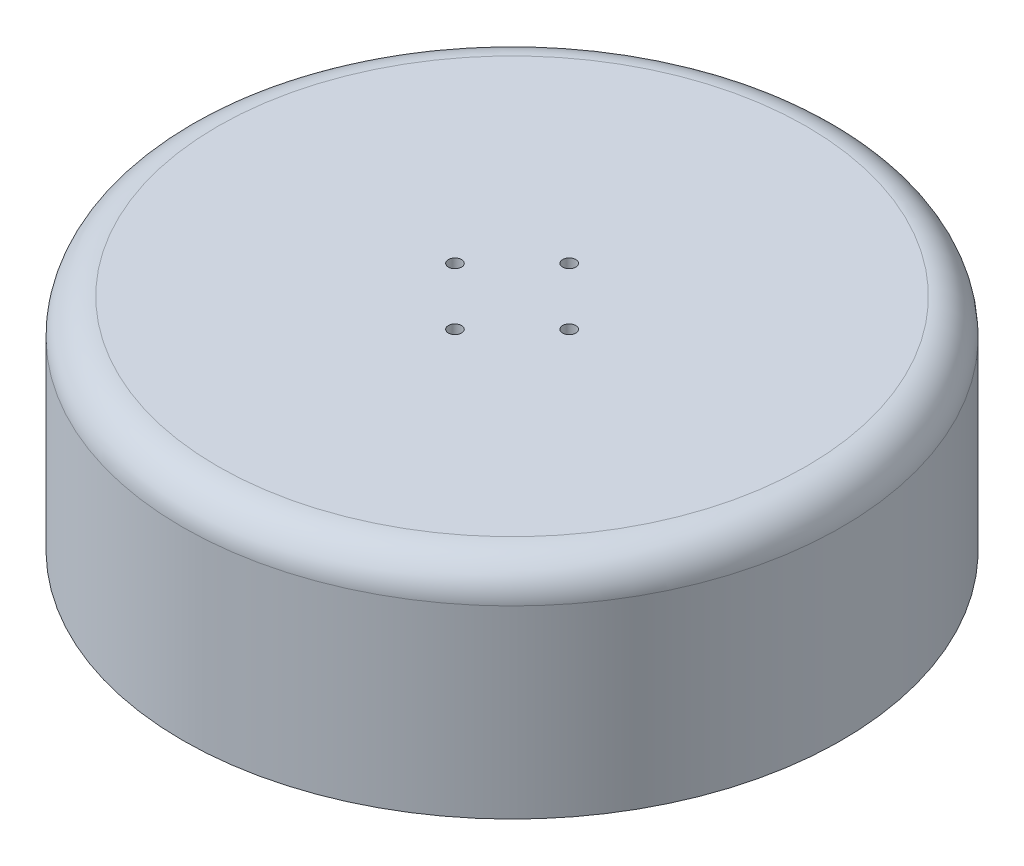
ISO-10303-21;
HEADER;
FILE_DESCRIPTION(('STEP AP214'),'2;1');
FILE_NAME('part.step','',(''),(''),'','','');
FILE_SCHEMA(('AUTOMOTIVE_DESIGN { 1 0 10303 214 1 1 1 1 }'));
ENDSEC;
DATA;
#1=APPLICATION_CONTEXT('core data for automotive mechanical design processes');
#2=APPLICATION_PROTOCOL_DEFINITION('international standard','automotive_design',2000,#1);
#3=PRODUCT_CONTEXT('',#1,'mechanical');
#4=PRODUCT('Part','Part','',(#3));
#5=PRODUCT_RELATED_PRODUCT_CATEGORY('part','',(#4));
#6=PRODUCT_DEFINITION_FORMATION('','',#4);
#7=PRODUCT_DEFINITION_CONTEXT('part definition',#1,'design');
#8=PRODUCT_DEFINITION('design','',#6,#7);
#9=PRODUCT_DEFINITION_SHAPE('','',#8);
#10=(LENGTH_UNIT() NAMED_UNIT(*) SI_UNIT(.MILLI.,.METRE.));
#11=(NAMED_UNIT(*) PLANE_ANGLE_UNIT() SI_UNIT($,.RADIAN.));
#12=(NAMED_UNIT(*) SI_UNIT($,.STERADIAN.) SOLID_ANGLE_UNIT());
#13=UNCERTAINTY_MEASURE_WITH_UNIT(LENGTH_MEASURE(1.E-05),#10,'distance_accuracy_value','');
#14=(GEOMETRIC_REPRESENTATION_CONTEXT(3) GLOBAL_UNCERTAINTY_ASSIGNED_CONTEXT((#13)) GLOBAL_UNIT_ASSIGNED_CONTEXT((#10,
#11,#12)) REPRESENTATION_CONTEXT('',''));
#15=CARTESIAN_POINT('',(0.,0.,0.));
#16=DIRECTION('',(0.,0.,1.));
#17=DIRECTION('',(1.,0.,0.));
#18=AXIS2_PLACEMENT_3D('',#15,#16,#17);
#19=CARTESIAN_POINT('',(0.,50.,0.));
#20=DIRECTION('',(0.,-1.,0.));
#21=DIRECTION('',(0.,0.,-1.));
#22=AXIS2_PLACEMENT_3D('',#19,#20,#21);
#23=CYLINDRICAL_SURFACE('',#22,75.);
#24=CARTESIAN_POINT('',(0.,42.,0.));
#25=DIRECTION('',(0.,1.,0.));
#26=DIRECTION('',(0.,0.,1.));
#27=AXIS2_PLACEMENT_3D('',#24,#25,#26);
#28=CIRCLE('',#27,75.);
#29=CARTESIAN_POINT('',(0.,42.,75.));
#30=VERTEX_POINT('',#29);
#31=EDGE_CURVE('E10',#30,#30,#28,.F.);
#32=ORIENTED_EDGE('',*,*,#31,.T.);
#33=EDGE_LOOP('',(#32));
#34=FACE_BOUND('',#33,.T.);
#35=CARTESIAN_POINT('',(0.,0.,0.));
#36=DIRECTION('',(0.,1.,0.));
#37=DIRECTION('',(0.,0.,1.));
#38=AXIS2_PLACEMENT_3D('',#35,#36,#37);
#39=CIRCLE('',#38,75.);
#40=CARTESIAN_POINT('',(0.,0.,75.));
#41=VERTEX_POINT('',#40);
#42=EDGE_CURVE('E42',#41,#41,#39,.T.);
#43=ORIENTED_EDGE('',*,*,#42,.T.);
#44=EDGE_LOOP('',(#43));
#45=FACE_BOUND('',#44,.T.);
#46=ADVANCED_FACE('F31',(#34,#45),#23,.T.);
#47=CARTESIAN_POINT('',(0.,50.,0.));
#48=DIRECTION('',(0.,1.,0.));
#49=DIRECTION('',(0.,0.,1.));
#50=AXIS2_PLACEMENT_3D('',#47,#48,#49);
#51=PLANE('',#50);
#52=CARTESIAN_POINT('',(0.,50.,-13.));
#53=DIRECTION('',(0.,1.,0.));
#54=DIRECTION('',(0.,0.,1.));
#55=AXIS2_PLACEMENT_3D('',#52,#53,#54);
#56=CIRCLE('',#55,1.5);
#57=CARTESIAN_POINT('',(0.,50.,-11.5));
#58=VERTEX_POINT('',#57);
#59=EDGE_CURVE('E67',#58,#58,#56,.T.);
#60=ORIENTED_EDGE('',*,*,#59,.F.);
#61=EDGE_LOOP('',(#60));
#62=FACE_BOUND('',#61,.T.);
#63=CARTESIAN_POINT('',(13.0000000000004,50.,-3.6789018175636E-13));
#64=DIRECTION('',(0.,1.,0.));
#65=DIRECTION('',(0.,0.,1.));
#66=AXIS2_PLACEMENT_3D('',#63,#64,#65);
#67=CIRCLE('',#66,1.50000000000029);
#68=CARTESIAN_POINT('',(13.0000000000004,50.,1.49999999999992));
#69=VERTEX_POINT('',#68);
#70=EDGE_CURVE('E61',#69,#69,#67,.T.);
#71=ORIENTED_EDGE('',*,*,#70,.F.);
#72=EDGE_LOOP('',(#71));
#73=FACE_BOUND('',#72,.T.);
#74=CARTESIAN_POINT('',(7.35780363512721E-13,50.,13.));
#75=DIRECTION('',(0.,1.,0.));
#76=DIRECTION('',(0.,0.,1.));
#77=AXIS2_PLACEMENT_3D('',#74,#75,#76);
#78=CIRCLE('',#77,1.50000000000079);
#79=CARTESIAN_POINT('',(7.35780363512721E-13,50.,14.5000000000008));
#80=VERTEX_POINT('',#79);
#81=EDGE_CURVE('E55',#80,#80,#78,.T.);
#82=ORIENTED_EDGE('',*,*,#81,.F.);
#83=EDGE_LOOP('',(#82));
#84=FACE_BOUND('',#83,.T.);
#85=CARTESIAN_POINT('',(-12.9999999999996,50.,3.69482222595252E-13));
#86=DIRECTION('',(0.,1.,0.));
#87=DIRECTION('',(0.,0.,1.));
#88=AXIS2_PLACEMENT_3D('',#85,#86,#87);
#89=CIRCLE('',#88,1.50000000000059);
#90=CARTESIAN_POINT('',(-12.9999999999996,50.,1.50000000000096));
#91=VERTEX_POINT('',#90);
#92=EDGE_CURVE('E49',#91,#91,#89,.T.);
#93=ORIENTED_EDGE('',*,*,#92,.F.);
#94=EDGE_LOOP('',(#93));
#95=FACE_BOUND('',#94,.T.);
#96=CARTESIAN_POINT('',(0.,50.,0.));
#97=DIRECTION('',(0.,1.,0.));
#98=DIRECTION('',(0.,0.,1.));
#99=AXIS2_PLACEMENT_3D('',#96,#97,#98);
#100=CIRCLE('',#99,67.);
#101=CARTESIAN_POINT('',(0.,50.,67.));
#102=VERTEX_POINT('',#101);
#103=EDGE_CURVE('E38',#102,#102,#100,.T.);
#104=ORIENTED_EDGE('',*,*,#103,.T.);
#105=EDGE_LOOP('',(#104));
#106=FACE_BOUND('',#105,.T.);
#107=ADVANCED_FACE('F82',(#62,#73,#84,#95,#106),#51,.T.);
#108=CARTESIAN_POINT('',(0.,0.,0.));
#109=DIRECTION('',(0.,1.,0.));
#110=DIRECTION('',(0.,0.,1.));
#111=AXIS2_PLACEMENT_3D('',#108,#109,#110);
#112=PLANE('',#111);
#113=ORIENTED_EDGE('',*,*,#42,.F.);
#114=EDGE_LOOP('',(#113));
#115=FACE_BOUND('',#114,.T.);
#116=ADVANCED_FACE('F85',(#115),#112,.F.);
#117=CARTESIAN_POINT('',(0.,42.,0.));
#118=DIRECTION('',(0.,1.,0.));
#119=DIRECTION('',(0.,0.,1.));
#120=AXIS2_PLACEMENT_3D('',#117,#118,#119);
#121=TOROIDAL_SURFACE('',#120,67.,8.);
#122=ORIENTED_EDGE('',*,*,#31,.F.);
#123=EDGE_LOOP('',(#122));
#124=FACE_BOUND('',#123,.T.);
#125=ORIENTED_EDGE('',*,*,#103,.F.);
#126=EDGE_LOOP('',(#125));
#127=FACE_BOUND('',#126,.T.);
#128=ADVANCED_FACE('F33',(#124,#127),#121,.T.);
#129=CARTESIAN_POINT('',(-12.9999999999996,46.,3.69482222595252E-13));
#130=DIRECTION('',(0.,1.,0.));
#131=DIRECTION('',(0.,0.,1.));
#132=AXIS2_PLACEMENT_3D('',#129,#130,#131);
#133=CYLINDRICAL_SURFACE('',#132,1.50000000000059);
#134=CARTESIAN_POINT('',(-12.9999999999996,46.,3.69482222595252E-13));
#135=DIRECTION('',(0.,1.,0.));
#136=DIRECTION('',(0.,0.,1.));
#137=AXIS2_PLACEMENT_3D('',#134,#135,#136);
#138=CIRCLE('',#137,1.50000000000059);
#139=CARTESIAN_POINT('',(-12.9999999999996,46.,1.50000000000096));
#140=VERTEX_POINT('',#139);
#141=EDGE_CURVE('E52',#140,#140,#138,.T.);
#142=ORIENTED_EDGE('',*,*,#141,.F.);
#143=EDGE_LOOP('',(#142));
#144=FACE_BOUND('',#143,.T.);
#145=ORIENTED_EDGE('',*,*,#92,.T.);
#146=EDGE_LOOP('',(#145));
#147=FACE_BOUND('',#146,.T.);
#148=ADVANCED_FACE('F93',(#144,#147),#133,.F.);
#149=CARTESIAN_POINT('',(-12.9999999999996,46.,3.69482222595252E-13));
#150=DIRECTION('',(0.,1.,0.));
#151=DIRECTION('',(0.,0.,1.));
#152=AXIS2_PLACEMENT_3D('',#149,#150,#151);
#153=PLANE('',#152);
#154=ORIENTED_EDGE('',*,*,#141,.T.);
#155=EDGE_LOOP('',(#154));
#156=FACE_BOUND('',#155,.T.);
#157=ADVANCED_FACE('F95',(#156),#153,.T.);
#158=CARTESIAN_POINT('',(7.35780363512721E-13,46.,13.));
#159=DIRECTION('',(0.,1.,0.));
#160=DIRECTION('',(0.,0.,1.));
#161=AXIS2_PLACEMENT_3D('',#158,#159,#160);
#162=CYLINDRICAL_SURFACE('',#161,1.50000000000079);
#163=CARTESIAN_POINT('',(7.35780363512721E-13,46.,13.));
#164=DIRECTION('',(0.,1.,0.));
#165=DIRECTION('',(0.,0.,1.));
#166=AXIS2_PLACEMENT_3D('',#163,#164,#165);
#167=CIRCLE('',#166,1.50000000000079);
#168=CARTESIAN_POINT('',(7.35780363512721E-13,46.,14.5000000000008));
#169=VERTEX_POINT('',#168);
#170=EDGE_CURVE('E58',#169,#169,#167,.T.);
#171=ORIENTED_EDGE('',*,*,#170,.F.);
#172=EDGE_LOOP('',(#171));
#173=FACE_BOUND('',#172,.T.);
#174=ORIENTED_EDGE('',*,*,#81,.T.);
#175=EDGE_LOOP('',(#174));
#176=FACE_BOUND('',#175,.T.);
#177=ADVANCED_FACE('F102',(#173,#176),#162,.F.);
#178=CARTESIAN_POINT('',(7.35780363512721E-13,46.,13.));
#179=DIRECTION('',(0.,1.,0.));
#180=DIRECTION('',(0.,0.,1.));
#181=AXIS2_PLACEMENT_3D('',#178,#179,#180);
#182=PLANE('',#181);
#183=ORIENTED_EDGE('',*,*,#170,.T.);
#184=EDGE_LOOP('',(#183));
#185=FACE_BOUND('',#184,.T.);
#186=ADVANCED_FACE('F146',(#185),#182,.T.);
#187=CARTESIAN_POINT('',(13.0000000000004,46.,-3.6789018175636E-13));
#188=DIRECTION('',(0.,1.,0.));
#189=DIRECTION('',(0.,0.,1.));
#190=AXIS2_PLACEMENT_3D('',#187,#188,#189);
#191=CYLINDRICAL_SURFACE('',#190,1.50000000000029);
#192=CARTESIAN_POINT('',(13.0000000000004,46.,-3.6789018175636E-13));
#193=DIRECTION('',(0.,1.,0.));
#194=DIRECTION('',(0.,0.,1.));
#195=AXIS2_PLACEMENT_3D('',#192,#193,#194);
#196=CIRCLE('',#195,1.50000000000029);
#197=CARTESIAN_POINT('',(13.0000000000004,46.,1.49999999999992));
#198=VERTEX_POINT('',#197);
#199=EDGE_CURVE('E64',#198,#198,#196,.T.);
#200=ORIENTED_EDGE('',*,*,#199,.F.);
#201=EDGE_LOOP('',(#200));
#202=FACE_BOUND('',#201,.T.);
#203=ORIENTED_EDGE('',*,*,#70,.T.);
#204=EDGE_LOOP('',(#203));
#205=FACE_BOUND('',#204,.T.);
#206=ADVANCED_FACE('F156',(#202,#205),#191,.F.);
#207=CARTESIAN_POINT('',(13.0000000000004,46.,-3.6789018175636E-13));
#208=DIRECTION('',(0.,1.,0.));
#209=DIRECTION('',(0.,0.,1.));
#210=AXIS2_PLACEMENT_3D('',#207,#208,#209);
#211=PLANE('',#210);
#212=ORIENTED_EDGE('',*,*,#199,.T.);
#213=EDGE_LOOP('',(#212));
#214=FACE_BOUND('',#213,.T.);
#215=ADVANCED_FACE('F78',(#214),#211,.T.);
#216=CARTESIAN_POINT('',(0.,46.,-13.));
#217=DIRECTION('',(0.,1.,0.));
#218=DIRECTION('',(0.,0.,1.));
#219=AXIS2_PLACEMENT_3D('',#216,#217,#218);
#220=CYLINDRICAL_SURFACE('',#219,1.5);
#221=CARTESIAN_POINT('',(0.,46.,-13.));
#222=DIRECTION('',(0.,1.,0.));
#223=DIRECTION('',(0.,0.,1.));
#224=AXIS2_PLACEMENT_3D('',#221,#222,#223);
#225=CIRCLE('',#224,1.5);
#226=CARTESIAN_POINT('',(0.,46.,-11.5));
#227=VERTEX_POINT('',#226);
#228=EDGE_CURVE('E46',#227,#227,#225,.T.);
#229=ORIENTED_EDGE('',*,*,#228,.F.);
#230=EDGE_LOOP('',(#229));
#231=FACE_BOUND('',#230,.T.);
#232=ORIENTED_EDGE('',*,*,#59,.T.);
#233=EDGE_LOOP('',(#232));
#234=FACE_BOUND('',#233,.T.);
#235=ADVANCED_FACE('F75',(#231,#234),#220,.F.);
#236=CARTESIAN_POINT('',(0.,46.,-13.));
#237=DIRECTION('',(0.,1.,0.));
#238=DIRECTION('',(0.,0.,1.));
#239=AXIS2_PLACEMENT_3D('',#236,#237,#238);
#240=PLANE('',#239);
#241=ORIENTED_EDGE('',*,*,#228,.T.);
#242=EDGE_LOOP('',(#241));
#243=FACE_BOUND('',#242,.T.);
#244=ADVANCED_FACE('F73',(#243),#240,.T.);
#245=CLOSED_SHELL('',(#46,#107,#116,#128,#148,#157,#177,#186,#206,#215,#235,#244));
#246=MANIFOLD_SOLID_BREP('B2',#245);
#247=ADVANCED_BREP_SHAPE_REPRESENTATION('',(#18,#246),#14);
#248=SHAPE_DEFINITION_REPRESENTATION(#9,#247);
ENDSEC;
END-ISO-10303-21;
